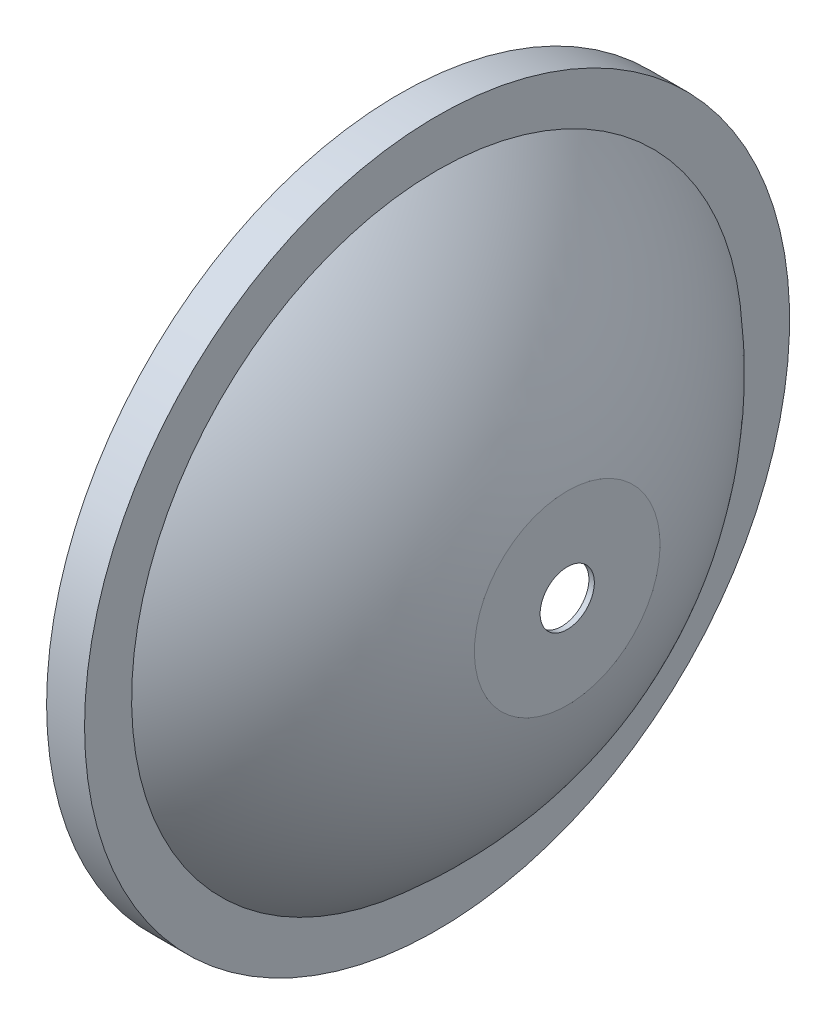
ISO-10303-21;
HEADER;
FILE_DESCRIPTION(('STEP AP214'),'2;1');
FILE_NAME('part.step','',(''),(''),'','','');
FILE_SCHEMA(('AUTOMOTIVE_DESIGN { 1 0 10303 214 1 1 1 1 }'));
ENDSEC;
DATA;
#1=APPLICATION_CONTEXT('core data for automotive mechanical design processes');
#2=APPLICATION_PROTOCOL_DEFINITION('international standard','automotive_design',2000,#1);
#3=PRODUCT_CONTEXT('',#1,'mechanical');
#4=PRODUCT('Part','Part','',(#3));
#5=PRODUCT_RELATED_PRODUCT_CATEGORY('part','',(#4));
#6=PRODUCT_DEFINITION_FORMATION('','',#4);
#7=PRODUCT_DEFINITION_CONTEXT('part definition',#1,'design');
#8=PRODUCT_DEFINITION('design','',#6,#7);
#9=PRODUCT_DEFINITION_SHAPE('','',#8);
#10=(LENGTH_UNIT() NAMED_UNIT(*) SI_UNIT(.MILLI.,.METRE.));
#11=(NAMED_UNIT(*) PLANE_ANGLE_UNIT() SI_UNIT($,.RADIAN.));
#12=(NAMED_UNIT(*) SI_UNIT($,.STERADIAN.) SOLID_ANGLE_UNIT());
#13=UNCERTAINTY_MEASURE_WITH_UNIT(LENGTH_MEASURE(1.E-05),#10,'distance_accuracy_value','');
#14=(GEOMETRIC_REPRESENTATION_CONTEXT(3) GLOBAL_UNCERTAINTY_ASSIGNED_CONTEXT((#13)) GLOBAL_UNIT_ASSIGNED_CONTEXT((#10,
#11,#12)) REPRESENTATION_CONTEXT('',''));
#15=CARTESIAN_POINT('',(0.,0.,0.));
#16=DIRECTION('',(0.,0.,1.));
#17=DIRECTION('',(1.,0.,0.));
#18=AXIS2_PLACEMENT_3D('',#15,#16,#17);
#19=CARTESIAN_POINT('',(-29.9929573971954,65.,0.));
#20=DIRECTION('',(1.,0.,0.));
#21=DIRECTION('',(0.,0.,-1.));
#22=AXIS2_PLACEMENT_3D('',#19,#20,#21);
#23=PLANE('',#22);
#24=CARTESIAN_POINT('',(-29.9929573971954,0.,0.));
#25=DIRECTION('',(-1.,0.,0.));
#26=DIRECTION('',(0.,0.,1.));
#27=AXIS2_PLACEMENT_3D('',#24,#25,#26);
#28=CIRCLE('',#27,64.);
#29=CARTESIAN_POINT('',(-29.9929573971954,0.,64.));
#30=VERTEX_POINT('',#29);
#31=EDGE_CURVE('E65',#30,#30,#28,.T.);
#32=ORIENTED_EDGE('',*,*,#31,.F.);
#33=EDGE_LOOP('',(#32));
#34=FACE_BOUND('',#33,.T.);
#35=CARTESIAN_POINT('',(-29.9929573971954,0.,0.));
#36=DIRECTION('',(-1.,0.,0.));
#37=DIRECTION('',(0.,0.,1.));
#38=AXIS2_PLACEMENT_3D('',#35,#36,#37);
#39=CIRCLE('',#38,65.);
#40=CARTESIAN_POINT('',(-29.9929573971954,0.,65.));
#41=VERTEX_POINT('',#40);
#42=EDGE_CURVE('E10',#41,#41,#39,.T.);
#43=ORIENTED_EDGE('',*,*,#42,.T.);
#44=EDGE_LOOP('',(#43));
#45=FACE_BOUND('',#44,.T.);
#46=ADVANCED_FACE('F31',(#34,#45),#23,.F.);
#47=CARTESIAN_POINT('',(-47.3913043478261,0.,0.));
#48=DIRECTION('',(-1.,0.,0.));
#49=DIRECTION('',(0.,0.,1.));
#50=AXIS2_PLACEMENT_3D('',#47,#48,#49);
#51=CYLINDRICAL_SURFACE('',#50,65.);
#52=ORIENTED_EDGE('',*,*,#42,.F.);
#53=EDGE_LOOP('',(#52));
#54=FACE_BOUND('',#53,.T.);
#55=CARTESIAN_POINT('',(-22.9929573971954,0.,0.));
#56=DIRECTION('',(-1.,0.,0.));
#57=DIRECTION('',(0.,0.,1.));
#58=AXIS2_PLACEMENT_3D('',#55,#56,#57);
#59=CIRCLE('',#58,65.);
#60=CARTESIAN_POINT('',(-22.9929573971954,0.,65.));
#61=VERTEX_POINT('',#60);
#62=EDGE_CURVE('E37',#61,#61,#59,.T.);
#63=ORIENTED_EDGE('',*,*,#62,.T.);
#64=EDGE_LOOP('',(#63));
#65=FACE_BOUND('',#64,.T.);
#66=ADVANCED_FACE('F72',(#54,#65),#51,.T.);
#67=CARTESIAN_POINT('',(-22.9929573971954,65.,0.));
#68=DIRECTION('',(-1.,0.,0.));
#69=DIRECTION('',(0.,0.,1.));
#70=AXIS2_PLACEMENT_3D('',#67,#68,#69);
#71=PLANE('',#70);
#72=ORIENTED_EDGE('',*,*,#62,.F.);
#73=EDGE_LOOP('',(#72));
#74=FACE_BOUND('',#73,.T.);
#75=CARTESIAN_POINT('',(-22.9929573971954,0.,0.));
#76=DIRECTION('',(-1.,0.,0.));
#77=DIRECTION('',(0.,0.,1.));
#78=AXIS2_PLACEMENT_3D('',#75,#76,#77);
#79=CIRCLE('',#78,56.3205113613149);
#80=CARTESIAN_POINT('',(-22.9929573971954,56.3205113613149,0.));
#81=VERTEX_POINT('',#80);
#82=EDGE_CURVE('E41',#81,#81,#79,.T.);
#83=ORIENTED_EDGE('',*,*,#82,.T.);
#84=EDGE_LOOP('',(#83));
#85=FACE_BOUND('',#84,.T.);
#86=ADVANCED_FACE('F76',(#74,#85),#71,.F.);
#87=CARTESIAN_POINT('',(-70.9929573971954,0.,0.));
#88=DIRECTION('',(-1.,0.,0.));
#89=DIRECTION('',(0.,1.,0.));
#90=AXIS2_PLACEMENT_3D('',#87,#88,#89);
#91=SPHERICAL_SURFACE('',#90,74.);
#92=CARTESIAN_POINT('',(1.,0.,0.));
#93=DIRECTION('',(-1.,0.,0.));
#94=DIRECTION('',(0.,0.,1.));
#95=AXIS2_PLACEMENT_3D('',#92,#93,#94);
#96=CIRCLE('',#95,17.1176541969281);
#97=CARTESIAN_POINT('',(1.,17.1176541969281,0.));
#98=VERTEX_POINT('',#97);
#99=EDGE_CURVE('E45',#98,#98,#96,.T.);
#100=CARTESIAN_POINT('',(-22.9929573971954,56.3205113613149,0.));
#101=CARTESIAN_POINT('',(-22.6224413895323,56.0047344228491,0.));
#102=CARTESIAN_POINT('',(-22.2550423613412,55.6853002306746,0.));
#103=CARTESIAN_POINT('',(-21.5266194076841,55.0392439667615,0.));
#104=CARTESIAN_POINT('',(-21.165595482218,54.7126218950229,0.));
#105=CARTESIAN_POINT('',(-20.4500638777918,54.0523164998345,0.));
#106=CARTESIAN_POINT('',(-20.0955561988317,53.7186331763848,0.));
#107=CARTESIAN_POINT('',(-19.3931950277699,53.044335406162,0.));
#108=CARTESIAN_POINT('',(-19.0453415356683,52.7037209593891,0.));
#109=CARTESIAN_POINT('',(-18.3564242651453,52.0156935695762,0.));
#110=CARTESIAN_POINT('',(-18.015360486724,51.6682806265364,0.));
#111=CARTESIAN_POINT('',(-17.340155478016,50.9667915731246,0.));
#112=CARTESIAN_POINT('',(-17.0060142477294,50.6127154627527,0.));
#113=CARTESIAN_POINT('',(-16.3447844862085,49.8980379844876,0.));
#114=CARTESIAN_POINT('',(-16.0176959549742,49.5374366165945,0.));
#115=CARTESIAN_POINT('',(-15.3706989920151,48.8098490785564,0.));
#116=CARTESIAN_POINT('',(-15.0507905602904,48.4428629084116,0.));
#117=CARTESIAN_POINT('',(-14.4182784010737,47.7026487069879,0.));
#118=CARTESIAN_POINT('',(-14.1056746735818,47.3294206757091,0.));
#119=CARTESIAN_POINT('',(-13.4878936821208,46.5768681246217,0.));
#120=CARTESIAN_POINT('',(-13.1827164181518,46.1975436048131,0.));
#121=CARTESIAN_POINT('',(-12.5799072204807,45.4329458237817,0.));
#122=CARTESIAN_POINT('',(-12.2822752867787,45.047672562559,0.));
#123=CARTESIAN_POINT('',(-11.6946726774573,44.2713273628735,0.));
#124=CARTESIAN_POINT('',(-11.4047020018379,43.8802554244107,0.));
#125=CARTESIAN_POINT('',(-10.8325348524376,43.0924651930021,0.));
#126=CARTESIAN_POINT('',(-10.5503383786566,42.6957469000563,0.));
#127=CARTESIAN_POINT('',(-9.99382954863118,41.8968184816986,0.));
#128=CARTESIAN_POINT('',(-9.7195171923867,41.4946083562868,0.));
#129=CARTESIAN_POINT('',(-9.17888344226409,40.6848529340856,0.));
#130=CARTESIAN_POINT('',(-8.91256204838597,40.2773076372964,0.));
#131=CARTESIAN_POINT('',(-8.38801395534113,39.4570406114817,0.));
#132=CARTESIAN_POINT('',(-8.1297872561744,39.0443188824563,0.));
#133=CARTESIAN_POINT('',(-7.62152913200893,38.2138597475342,0.));
#134=CARTESIAN_POINT('',(-7.37149770701019,37.7961223416375,0.));
#135=CARTESIAN_POINT('',(-6.87972751857295,36.9557945619466,0.));
#136=CARTESIAN_POINT('',(-6.63798875513446,36.5332041881525,0.));
#137=CARTESIAN_POINT('',(-6.16289804721329,35.6833350718747,0.));
#138=CARTESIAN_POINT('',(-5.92954610273061,35.2560563293911,0.));
#139=CARTESIAN_POINT('',(-5.47131992344547,34.3969769010648,0.));
#140=CARTESIAN_POINT('',(-5.246445688643,33.965176215222,0.));
#141=CARTESIAN_POINT('',(-4.80526251737,33.0972210868074,0.));
#142=CARTESIAN_POINT('',(-4.58895358089947,32.6610666442356,0.));
#143=CARTESIAN_POINT('',(-4.1649852587514,31.784573884784,0.));
#144=CARTESIAN_POINT('',(-3.95732587307385,31.3442355679043,0.));
#145=CARTESIAN_POINT('',(-3.55073753597434,30.4595465718783,0.));
#146=CARTESIAN_POINT('',(-3.35180858455238,30.015195892732,0.));
#147=CARTESIAN_POINT('',(-2.9627585988914,29.1226552470379,0.));
#148=CARTESIAN_POINT('',(-2.77263756465237,28.6744652804903,0.));
#149=CARTESIAN_POINT('',(-2.4012774656918,27.7744206302389,0.));
#150=CARTESIAN_POINT('',(-2.22003840097026,27.3225659465351,0.));
#151=CARTESIAN_POINT('',(-1.86651283348736,26.4153678597193,0.));
#152=CARTESIAN_POINT('',(-1.694226330726,25.9600244566072,0.));
#153=CARTESIAN_POINT('',(-1.35867299391867,25.0460262872338,0.));
#154=CARTESIAN_POINT('',(-1.1954061598727,24.5873715209726,0.));
#155=CARTESIAN_POINT('',(-0.877955749080872,23.6669292726327,0.));
#156=CARTESIAN_POINT('',(-0.723772172335014,23.2051417905541,0.));
#157=CARTESIAN_POINT('',(-0.424548345469187,22.2786139732743,0.));
#158=CARTESIAN_POINT('',(-0.279508095349218,21.8138736380731,0.));
#159=CARTESIAN_POINT('',(0.00137263996750369,20.8816211454133,0.));
#160=CARTESIAN_POINT('',(0.137213125164257,20.4141089879546,0.));
#161=CARTESIAN_POINT('',(0.399641215538045,19.4764948939743,0.));
#162=CARTESIAN_POINT('',(0.52622882071508,19.0063929574528,0.));
#163=CARTESIAN_POINT('',(0.770102610710882,18.0637826084172,0.));
#164=CARTESIAN_POINT('',(0.887388795529648,17.5912741959032,0.));
#165=CARTESIAN_POINT('',(1.,17.1176541969281,0.));
#166=B_SPLINE_CURVE_WITH_KNOTS('',3,(#100,#101,#102,#103,#104,#105,#106,#107,#108,#109,#110,
#111,#112,#113,#114,#115,#116,#117,#118,#119,#120,#121,#122,#123,#124,#125,#126,#127,#128,#129,
#130,#131,#132,#133,#134,#135,#136,#137,#138,#139,#140,#141,#142,#143,#144,#145,#146,#147,#148,
#149,#150,#151,#152,#153,#154,#155,#156,#157,#158,#159,#160,#161,#162,#163,#164,#165),
.UNSPECIFIED.,.F.,.F.,(4,2,2,2,2,2,2,2,2,2,2,2,2,2,2,2,2,2,2,2,2,2,2,2,2,2,2,2,2,2,2,2,4),(0.,
1.46044696389162,2.92089392778324,4.38134089167486,5.84178785556648,7.3022348194581,
8.76268178334973,10.2231287472413,11.683575711133,13.1440226750246,14.6044696389162,
16.0649166028078,17.5253635666994,18.9858105305911,20.4462574944827,21.9067044583743,
23.3671514222659,24.8275983861576,26.2880453500492,27.7484923139408,29.2089392778324,
30.669386241724,32.1298332056157,33.5902801695073,35.0507271333989,36.5111740972905,
37.9716210611821,39.4320680250737,40.8925149889654,42.352961952857,43.8134089167486,
45.2738558806402,46.7343028445318),.UNSPECIFIED.);
#167=EDGE_CURVE('BSEAM81',#81,#98,#166,.T.);
#168=ORIENTED_EDGE('',*,*,#82,.F.);
#169=ORIENTED_EDGE('',*,*,#99,.T.);
#170=ORIENTED_EDGE('',*,*,#167,.T.);
#171=ORIENTED_EDGE('',*,*,#167,.F.);
#172=EDGE_LOOP('',(#168,#170,#169,#171));
#173=FACE_BOUND('',#172,.T.);
#174=ADVANCED_FACE('F81',(#173),#91,.T.);
#175=CARTESIAN_POINT('',(1.,5.,0.));
#176=DIRECTION('',(-1.,0.,0.));
#177=DIRECTION('',(0.,0.,1.));
#178=AXIS2_PLACEMENT_3D('',#175,#176,#177);
#179=PLANE('',#178);
#180=ORIENTED_EDGE('',*,*,#99,.F.);
#181=EDGE_LOOP('',(#180));
#182=FACE_BOUND('',#181,.T.);
#183=CARTESIAN_POINT('',(1.,0.,0.));
#184=DIRECTION('',(-1.,0.,0.));
#185=DIRECTION('',(0.,0.,1.));
#186=AXIS2_PLACEMENT_3D('',#183,#184,#185);
#187=CIRCLE('',#186,5.);
#188=CARTESIAN_POINT('',(1.,0.,5.));
#189=VERTEX_POINT('',#188);
#190=EDGE_CURVE('E50',#189,#189,#187,.T.);
#191=ORIENTED_EDGE('',*,*,#190,.T.);
#192=EDGE_LOOP('',(#191));
#193=FACE_BOUND('',#192,.T.);
#194=ADVANCED_FACE('F87',(#182,#193),#179,.F.);
#195=CARTESIAN_POINT('',(-47.3913043478261,0.,0.));
#196=DIRECTION('',(-1.,0.,0.));
#197=DIRECTION('',(0.,0.,1.));
#198=AXIS2_PLACEMENT_3D('',#195,#196,#197);
#199=CYLINDRICAL_SURFACE('',#198,5.);
#200=ORIENTED_EDGE('',*,*,#190,.F.);
#201=EDGE_LOOP('',(#200));
#202=FACE_BOUND('',#201,.T.);
#203=CARTESIAN_POINT('',(0.,0.,0.));
#204=DIRECTION('',(-1.,0.,0.));
#205=DIRECTION('',(0.,0.,1.));
#206=AXIS2_PLACEMENT_3D('',#203,#204,#205);
#207=CIRCLE('',#206,5.);
#208=CARTESIAN_POINT('',(0.,0.,5.));
#209=VERTEX_POINT('',#208);
#210=EDGE_CURVE('E53',#209,#209,#207,.T.);
#211=ORIENTED_EDGE('',*,*,#210,.T.);
#212=EDGE_LOOP('',(#211));
#213=FACE_BOUND('',#212,.T.);
#214=ADVANCED_FACE('F91',(#202,#213),#199,.F.);
#215=CARTESIAN_POINT('',(0.,5.,0.));
#216=DIRECTION('',(1.,0.,0.));
#217=DIRECTION('',(0.,0.,-1.));
#218=AXIS2_PLACEMENT_3D('',#215,#216,#217);
#219=PLANE('',#218);
#220=ORIENTED_EDGE('',*,*,#210,.F.);
#221=EDGE_LOOP('',(#220));
#222=FACE_BOUND('',#221,.T.);
#223=CARTESIAN_POINT('',(0.,0.,0.));
#224=DIRECTION('',(-1.,0.,0.));
#225=DIRECTION('',(0.,0.,1.));
#226=AXIS2_PLACEMENT_3D('',#223,#224,#225);
#227=CIRCLE('',#226,17.);
#228=CARTESIAN_POINT('',(0.,16.9999999999999,0.));
#229=VERTEX_POINT('',#228);
#230=EDGE_CURVE('E56',#229,#229,#227,.T.);
#231=ORIENTED_EDGE('',*,*,#230,.T.);
#232=EDGE_LOOP('',(#231));
#233=FACE_BOUND('',#232,.T.);
#234=ADVANCED_FACE('F95',(#222,#233),#219,.F.);
#235=CARTESIAN_POINT('',(-70.9929573971954,0.,0.));
#236=DIRECTION('',(-1.,0.,0.));
#237=DIRECTION('',(0.,1.,0.));
#238=AXIS2_PLACEMENT_3D('',#235,#236,#237);
#239=SPHERICAL_SURFACE('',#238,73.);
#240=CARTESIAN_POINT('',(-23.9929573971954,0.,0.));
#241=DIRECTION('',(-1.,0.,0.));
#242=DIRECTION('',(0.,0.,1.));
#243=AXIS2_PLACEMENT_3D('',#240,#241,#242);
#244=CIRCLE('',#243,55.8569601750758);
#245=CARTESIAN_POINT('',(-23.9929573971954,55.8569601750758,0.));
#246=VERTEX_POINT('',#245);
#247=EDGE_CURVE('E59',#246,#246,#244,.T.);
#248=CARTESIAN_POINT('',(0.,16.9999999999999,0.));
#249=CARTESIAN_POINT('',(-0.112670572638843,17.4705215884801,0.));
#250=CARTESIAN_POINT('',(-0.230020169997314,17.9399227117786,0.));
#251=CARTESIAN_POINT('',(-0.47402812036496,18.8762992173911,0.));
#252=CARTESIAN_POINT('',(-0.600686473374135,19.3432745997053,0.));
#253=CARTESIAN_POINT('',(-0.86326264125472,20.2746148127283,0.));
#254=CARTESIAN_POINT('',(-0.999180456126131,20.7389796434373,0.));
#255=CARTESIAN_POINT('',(-1.280221607374,21.6649152316034,0.));
#256=CARTESIAN_POINT('',(-1.42534494375047,22.1264859890606,0.));
#257=CARTESIAN_POINT('',(-1.72473982267243,23.0466509447988,0.));
#258=CARTESIAN_POINT('',(-1.87901136521793,23.5052451430799,0.));
#259=CARTESIAN_POINT('',(-2.19664165381383,24.4192756897042,0.));
#260=CARTESIAN_POINT('',(-2.36000039986423,24.8747120380474,0.));
#261=CARTESIAN_POINT('',(-2.69574051935858,25.7822468374741,0.));
#262=CARTESIAN_POINT('',(-2.86812189280254,26.2343452885577,0.));
#263=CARTESIAN_POINT('',(-3.22183911900175,27.1350255670288,0.));
#264=CARTESIAN_POINT('',(-3.40317497175701,27.5836073944164,0.));
#265=CARTESIAN_POINT('',(-3.77472946991123,28.4770770889206,0.));
#266=CARTESIAN_POINT('',(-3.96494811531018,28.9219649560371,0.));
#267=CARTESIAN_POINT('',(-4.35419300011166,29.8078708538415,0.));
#268=CARTESIAN_POINT('',(-4.55321923951418,30.2488888845293,0.));
#269=CARTESIAN_POINT('',(-4.96000063190089,31.1268807631437,0.));
#270=CARTESIAN_POINT('',(-5.16775578488507,31.5638546110702,0.));
#271=CARTESIAN_POINT('',(-5.59191287321192,32.4335853766109,0.));
#272=CARTESIAN_POINT('',(-5.8083148085546,32.8663422942251,0.));
#273=CARTESIAN_POINT('',(-6.24967991207589,33.7274681186546,0.));
#274=CARTESIAN_POINT('',(-6.47464308025451,34.1558370254698,0.));
#275=CARTESIAN_POINT('',(-6.93304171543698,35.0080174825143,0.));
#276=CARTESIAN_POINT('',(-7.16647718244082,35.4318290327436,0.));
#277=CARTESIAN_POINT('',(-7.64172813193514,36.274727232475,0.));
#278=CARTESIAN_POINT('',(-7.88354361442563,36.6938138819771,0.));
#279=CARTESIAN_POINT('',(-8.3754589987083,37.5270966039939,0.));
#280=CARTESIAN_POINT('',(-8.62555890050049,37.9412926765086,0.));
#281=CARTESIAN_POINT('',(-9.13394425214719,38.7646305016671,0.));
#282=CARTESIAN_POINT('',(-9.39222970200171,39.173772254311,0.));
#283=CARTESIAN_POINT('',(-9.91688404256566,39.9868396949536,0.));
#284=CARTESIAN_POINT('',(-10.1832529332751,40.3907653829524,0.));
#285=CARTESIAN_POINT('',(-10.7239688527392,41.1932410115815,0.));
#286=CARTESIAN_POINT('',(-10.9983158814939,41.5917909522119,0.));
#287=CARTESIAN_POINT('',(-11.5548796202656,42.3833575285593,0.));
#288=CARTESIAN_POINT('',(-11.8370963302826,42.7763741642762,0.));
#289=CARTESIAN_POINT('',(-12.4092878636989,43.5567187607157,0.));
#290=CARTESIAN_POINT('',(-12.6992626870981,43.9440467214384,0.));
#291=CARTESIAN_POINT('',(-13.2868558124061,44.7128608466967,0.));
#292=CARTESIAN_POINT('',(-13.5844741143149,45.0943470112324,0.));
#293=CARTESIAN_POINT('',(-14.1872365401005,45.8513267323385,0.));
#294=CARTESIAN_POINT('',(-14.4923806639774,46.2268202889088,0.));
#295=CARTESIAN_POINT('',(-15.1100741019797,46.9716663513658,0.));
#296=CARTESIAN_POINT('',(-15.4226234161051,47.3410188572524,0.));
#297=CARTESIAN_POINT('',(-16.0550036754797,48.0734368032704,0.));
#298=CARTESIAN_POINT('',(-16.374834620729,48.4365022434018,0.));
#299=CARTESIAN_POINT('',(-17.0216517043532,49.1562025285684,0.));
#300=CARTESIAN_POINT('',(-17.348637842728,49.5128373736035,0.));
#301=CARTESIAN_POINT('',(-18.0096360468915,50.2195354803658,0.));
#302=CARTESIAN_POINT('',(-18.3436481126801,50.5695987420928,0.));
#303=CARTESIAN_POINT('',(-19.0185661249594,51.2630152959021,0.));
#304=CARTESIAN_POINT('',(-19.3594720714501,51.6063685879843,0.));
#305=CARTESIAN_POINT('',(-20.0480430860019,52.2862294540537,0.));
#306=CARTESIAN_POINT('',(-20.395708154063,52.6227370280408,0.));
#307=CARTESIAN_POINT('',(-21.0976599323541,53.2887734707984,0.));
#308=CARTESIAN_POINT('',(-21.4519466425842,53.6183023395688,0.));
#309=CARTESIAN_POINT('',(-22.1670017880071,54.2702509382611,0.));
#310=CARTESIAN_POINT('',(-22.5277702232,54.592670668183,0.));
#311=CARTESIAN_POINT('',(-23.2556456675121,55.230274132472,0.));
#312=CARTESIAN_POINT('',(-23.6227526766313,55.5454578668391,0.));
#313=CARTESIAN_POINT('',(-23.9929573971954,55.8569601750758,0.));
#314=B_SPLINE_CURVE_WITH_KNOTS('',3,(#248,#249,#250,#251,#252,#253,#254,#255,#256,#257,#258,
#259,#260,#261,#262,#263,#264,#265,#266,#267,#268,#269,#270,#271,#272,#273,#274,#275,#276,#277,
#278,#279,#280,#281,#282,#283,#284,#285,#286,#287,#288,#289,#290,#291,#292,#293,#294,#295,#296,
#297,#298,#299,#300,#301,#302,#303,#304,#305,#306,#307,#308,#309,#310,#311,#312,#313),
.UNSPECIFIED.,.F.,.F.,(4,2,2,2,2,2,2,2,2,2,2,2,2,2,2,2,2,2,2,2,2,2,2,2,2,2,2,2,2,2,2,2,4),(0.,
1.45144668774807,2.90289337549614,4.35434006324422,5.80578675099229,7.25723343874036,
8.70868012648843,10.1601268142365,11.6115735019846,13.0630201897327,14.5144668774807,
15.9659135652288,17.4173602529769,18.8688069407249,20.320253628473,21.7717003162211,
23.2231470039692,24.6745936917172,26.1260403794653,27.5774870672134,29.0289337549614,
30.4803804427095,31.9318271304576,33.3832738182057,34.8347205059537,36.2861671937018,
37.7376138814499,39.189060569198,40.640507256946,42.0919539446941,43.5434006324422,
44.9948473201902,46.4462940079383),.UNSPECIFIED.);
#315=EDGE_CURVE('BSEAM99',#229,#246,#314,.T.);
#316=ORIENTED_EDGE('',*,*,#230,.F.);
#317=ORIENTED_EDGE('',*,*,#247,.T.);
#318=ORIENTED_EDGE('',*,*,#315,.T.);
#319=ORIENTED_EDGE('',*,*,#315,.F.);
#320=EDGE_LOOP('',(#316,#318,#317,#319));
#321=FACE_BOUND('',#320,.T.);
#322=ADVANCED_FACE('F99',(#321),#239,.F.);
#323=CARTESIAN_POINT('',(-23.9929573971954,64.,0.));
#324=DIRECTION('',(1.,0.,0.));
#325=DIRECTION('',(0.,0.,-1.));
#326=AXIS2_PLACEMENT_3D('',#323,#324,#325);
#327=PLANE('',#326);
#328=ORIENTED_EDGE('',*,*,#247,.F.);
#329=EDGE_LOOP('',(#328));
#330=FACE_BOUND('',#329,.T.);
#331=CARTESIAN_POINT('',(-23.9929573971954,0.,0.));
#332=DIRECTION('',(-1.,0.,0.));
#333=DIRECTION('',(0.,0.,1.));
#334=AXIS2_PLACEMENT_3D('',#331,#332,#333);
#335=CIRCLE('',#334,64.);
#336=CARTESIAN_POINT('',(-23.9929573971954,0.,64.));
#337=VERTEX_POINT('',#336);
#338=EDGE_CURVE('E62',#337,#337,#335,.T.);
#339=ORIENTED_EDGE('',*,*,#338,.T.);
#340=EDGE_LOOP('',(#339));
#341=FACE_BOUND('',#340,.T.);
#342=ADVANCED_FACE('F103',(#330,#341),#327,.F.);
#343=CARTESIAN_POINT('',(-47.3913043478261,0.,0.));
#344=DIRECTION('',(-1.,0.,0.));
#345=DIRECTION('',(0.,0.,1.));
#346=AXIS2_PLACEMENT_3D('',#343,#344,#345);
#347=CYLINDRICAL_SURFACE('',#346,64.);
#348=ORIENTED_EDGE('',*,*,#338,.F.);
#349=EDGE_LOOP('',(#348));
#350=FACE_BOUND('',#349,.T.);
#351=ORIENTED_EDGE('',*,*,#31,.T.);
#352=EDGE_LOOP('',(#351));
#353=FACE_BOUND('',#352,.T.);
#354=ADVANCED_FACE('F69',(#350,#353),#347,.F.);
#355=CLOSED_SHELL('',(#46,#66,#86,#174,#194,#214,#234,#322,#342,#354));
#356=MANIFOLD_SOLID_BREP('B2',#355);
#357=ADVANCED_BREP_SHAPE_REPRESENTATION('',(#18,#356),#14);
#358=SHAPE_DEFINITION_REPRESENTATION(#9,#357);
ENDSEC;
END-ISO-10303-21;
